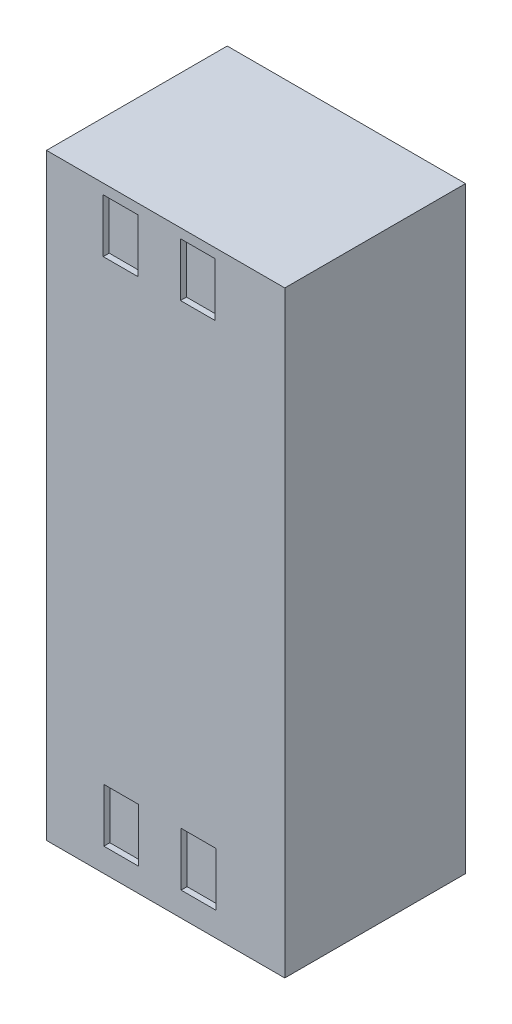
ISO-10303-21;
HEADER;
FILE_DESCRIPTION(('STEP AP214'),'2;1');
FILE_NAME('part.step','',(''),(''),'','','');
FILE_SCHEMA(('AUTOMOTIVE_DESIGN { 1 0 10303 214 1 1 1 1 }'));
ENDSEC;
DATA;
#1=APPLICATION_CONTEXT('core data for automotive mechanical design processes');
#2=APPLICATION_PROTOCOL_DEFINITION('international standard','automotive_design',2000,#1);
#3=PRODUCT_CONTEXT('',#1,'mechanical');
#4=PRODUCT('Part','Part','',(#3));
#5=PRODUCT_RELATED_PRODUCT_CATEGORY('part','',(#4));
#6=PRODUCT_DEFINITION_FORMATION('','',#4);
#7=PRODUCT_DEFINITION_CONTEXT('part definition',#1,'design');
#8=PRODUCT_DEFINITION('design','',#6,#7);
#9=PRODUCT_DEFINITION_SHAPE('','',#8);
#10=(LENGTH_UNIT() NAMED_UNIT(*) SI_UNIT(.MILLI.,.METRE.));
#11=(NAMED_UNIT(*) PLANE_ANGLE_UNIT() SI_UNIT($,.RADIAN.));
#12=(NAMED_UNIT(*) SI_UNIT($,.STERADIAN.) SOLID_ANGLE_UNIT());
#13=UNCERTAINTY_MEASURE_WITH_UNIT(LENGTH_MEASURE(1.E-05),#10,'distance_accuracy_value','');
#14=(GEOMETRIC_REPRESENTATION_CONTEXT(3) GLOBAL_UNCERTAINTY_ASSIGNED_CONTEXT((#13)) GLOBAL_UNIT_ASSIGNED_CONTEXT((#10,
#11,#12)) REPRESENTATION_CONTEXT('',''));
#15=CARTESIAN_POINT('',(0.,0.,0.));
#16=DIRECTION('',(0.,0.,1.));
#17=DIRECTION('',(1.,0.,0.));
#18=AXIS2_PLACEMENT_3D('',#15,#16,#17);
#19=CARTESIAN_POINT('',(0.,0.,38.354));
#20=DIRECTION('',(1.,0.,0.));
#21=DIRECTION('',(0.,0.,-1.));
#22=AXIS2_PLACEMENT_3D('',#19,#20,#21);
#23=PLANE('',#22);
#24=DIRECTION('',(0.,-1.,0.));
#25=VECTOR('',#24,1.);
#26=CARTESIAN_POINT('',(0.,0.,0.));
#27=LINE('',#26,#25);
#28=CARTESIAN_POINT('',(0.,0.,0.));
#29=VERTEX_POINT('',#28);
#30=CARTESIAN_POINT('',(0.,-126.812282011967,0.));
#31=VERTEX_POINT('',#30);
#32=EDGE_CURVE('E388',#29,#31,#27,.T.);
#33=ORIENTED_EDGE('',*,*,#32,.T.);
#34=DIRECTION('',(0.,0.,-1.));
#35=VECTOR('',#34,1.);
#36=CARTESIAN_POINT('',(0.,-126.812282011967,38.354));
#37=LINE('',#36,#35);
#38=CARTESIAN_POINT('',(0.,-126.812282011967,38.354));
#39=VERTEX_POINT('',#38);
#40=EDGE_CURVE('E421',#39,#31,#37,.T.);
#41=ORIENTED_EDGE('',*,*,#40,.F.);
#42=DIRECTION('',(0.,-1.,0.));
#43=VECTOR('',#42,1.);
#44=CARTESIAN_POINT('',(0.,0.,38.354));
#45=LINE('',#44,#43);
#46=CARTESIAN_POINT('',(0.,0.,38.354));
#47=VERTEX_POINT('',#46);
#48=EDGE_CURVE('E395',#47,#39,#45,.T.);
#49=ORIENTED_EDGE('',*,*,#48,.F.);
#50=DIRECTION('',(0.,0.,-1.));
#51=VECTOR('',#50,1.);
#52=CARTESIAN_POINT('',(0.,0.,38.354));
#53=LINE('',#52,#51);
#54=EDGE_CURVE('E405',#47,#29,#53,.T.);
#55=ORIENTED_EDGE('',*,*,#54,.T.);
#56=EDGE_LOOP('',(#33,#41,#49,#55));
#57=FACE_BOUND('',#56,.T.);
#58=ADVANCED_FACE('F43',(#57),#23,.F.);
#59=CARTESIAN_POINT('',(0.,-126.812282011967,38.354));
#60=DIRECTION('',(0.,1.,0.));
#61=DIRECTION('',(0.,0.,1.));
#62=AXIS2_PLACEMENT_3D('',#59,#60,#61);
#63=PLANE('',#62);
#64=DIRECTION('',(1.,0.,0.));
#65=VECTOR('',#64,1.);
#66=CARTESIAN_POINT('',(0.,-126.812282011967,0.));
#67=LINE('',#66,#65);
#68=CARTESIAN_POINT('',(50.5658640729152,-126.812282011967,0.));
#69=VERTEX_POINT('',#68);
#70=EDGE_CURVE('E408',#31,#69,#67,.T.);
#71=ORIENTED_EDGE('',*,*,#70,.T.);
#72=DIRECTION('',(0.,0.,-1.));
#73=VECTOR('',#72,1.);
#74=CARTESIAN_POINT('',(50.5658640729152,-126.812282011967,38.354));
#75=LINE('',#74,#73);
#76=CARTESIAN_POINT('',(50.5658640729152,-126.812282011967,38.354));
#77=VERTEX_POINT('',#76);
#78=EDGE_CURVE('E418',#77,#69,#75,.T.);
#79=ORIENTED_EDGE('',*,*,#78,.F.);
#80=DIRECTION('',(1.,0.,0.));
#81=VECTOR('',#80,1.);
#82=CARTESIAN_POINT('',(0.,-126.812282011967,38.354));
#83=LINE('',#82,#81);
#84=EDGE_CURVE('E398',#39,#77,#83,.T.);
#85=ORIENTED_EDGE('',*,*,#84,.F.);
#86=ORIENTED_EDGE('',*,*,#40,.T.);
#87=EDGE_LOOP('',(#71,#79,#85,#86));
#88=FACE_BOUND('',#87,.T.);
#89=ADVANCED_FACE('F486',(#88),#63,.F.);
#90=CARTESIAN_POINT('',(50.5658640729152,0.,38.354));
#91=DIRECTION('',(-1.,0.,0.));
#92=DIRECTION('',(0.,0.,1.));
#93=AXIS2_PLACEMENT_3D('',#90,#91,#92);
#94=PLANE('',#93);
#95=DIRECTION('',(0.,1.,0.));
#96=VECTOR('',#95,1.);
#97=CARTESIAN_POINT('',(50.5658640729152,0.,0.));
#98=LINE('',#97,#96);
#99=CARTESIAN_POINT('',(50.5658640729152,0.,0.));
#100=VERTEX_POINT('',#99);
#101=EDGE_CURVE('E410',#69,#100,#98,.T.);
#102=ORIENTED_EDGE('',*,*,#101,.T.);
#103=DIRECTION('',(0.,0.,-1.));
#104=VECTOR('',#103,1.);
#105=CARTESIAN_POINT('',(50.5658640729152,0.,38.354));
#106=LINE('',#105,#104);
#107=CARTESIAN_POINT('',(50.5658640729152,0.,38.354));
#108=VERTEX_POINT('',#107);
#109=EDGE_CURVE('E415',#108,#100,#106,.T.);
#110=ORIENTED_EDGE('',*,*,#109,.F.);
#111=DIRECTION('',(0.,1.,0.));
#112=VECTOR('',#111,1.);
#113=CARTESIAN_POINT('',(50.5658640729152,0.,38.354));
#114=LINE('',#113,#112);
#115=EDGE_CURVE('E401',#77,#108,#114,.T.);
#116=ORIENTED_EDGE('',*,*,#115,.F.);
#117=ORIENTED_EDGE('',*,*,#78,.T.);
#118=EDGE_LOOP('',(#102,#110,#116,#117));
#119=FACE_BOUND('',#118,.T.);
#120=ADVANCED_FACE('F490',(#119),#94,.F.);
#121=CARTESIAN_POINT('',(0.,0.,38.354));
#122=DIRECTION('',(0.,-1.,0.));
#123=DIRECTION('',(0.,0.,-1.));
#124=AXIS2_PLACEMENT_3D('',#121,#122,#123);
#125=PLANE('',#124);
#126=DIRECTION('',(-1.,0.,0.));
#127=VECTOR('',#126,1.);
#128=CARTESIAN_POINT('',(0.,0.,0.));
#129=LINE('',#128,#127);
#130=EDGE_CURVE('E399',#100,#29,#129,.T.);
#131=ORIENTED_EDGE('',*,*,#130,.T.);
#132=ORIENTED_EDGE('',*,*,#54,.F.);
#133=DIRECTION('',(-1.,0.,0.));
#134=VECTOR('',#133,1.);
#135=CARTESIAN_POINT('',(0.,0.,38.354));
#136=LINE('',#135,#134);
#137=EDGE_CURVE('E403',#108,#47,#136,.T.);
#138=ORIENTED_EDGE('',*,*,#137,.F.);
#139=ORIENTED_EDGE('',*,*,#109,.T.);
#140=EDGE_LOOP('',(#131,#132,#138,#139));
#141=FACE_BOUND('',#140,.T.);
#142=ADVANCED_FACE('F494',(#141),#125,.F.);
#143=CARTESIAN_POINT('',(0.,0.,38.354));
#144=DIRECTION('',(0.,0.,1.));
#145=DIRECTION('',(1.,0.,0.));
#146=AXIS2_PLACEMENT_3D('',#143,#144,#145);
#147=PLANE('',#146);
#148=DIRECTION('',(0.,-1.,0.));
#149=VECTOR('',#148,1.);
#150=CARTESIAN_POINT('',(28.565766674965,-110.300002704912,38.354));
#151=LINE('',#150,#149);
#152=CARTESIAN_POINT('',(28.565766674965,-110.300002704912,38.354));
#153=VERTEX_POINT('',#152);
#154=CARTESIAN_POINT('',(28.565766674965,-121.661911213981,38.354));
#155=VERTEX_POINT('',#154);
#156=EDGE_CURVE('E69',#153,#155,#151,.T.);
#157=ORIENTED_EDGE('',*,*,#156,.F.);
#158=DIRECTION('',(-1.,0.,0.));
#159=VECTOR('',#158,1.);
#160=CARTESIAN_POINT('',(28.565766674965,-110.300002704912,38.354));
#161=LINE('',#160,#159);
#162=CARTESIAN_POINT('',(35.9408687517537,-110.300002704912,38.354));
#163=VERTEX_POINT('',#162);
#164=EDGE_CURVE('E305',#163,#153,#161,.T.);
#165=ORIENTED_EDGE('',*,*,#164,.F.);
#166=DIRECTION('',(0.,1.,0.));
#167=VECTOR('',#166,1.);
#168=CARTESIAN_POINT('',(35.9408687517537,-110.300002704912,38.354));
#169=LINE('',#168,#167);
#170=CARTESIAN_POINT('',(35.9408687517537,-121.661911213981,38.354));
#171=VERTEX_POINT('',#170);
#172=EDGE_CURVE('E320',#171,#163,#169,.T.);
#173=ORIENTED_EDGE('',*,*,#172,.F.);
#174=DIRECTION('',(1.,0.,0.));
#175=VECTOR('',#174,1.);
#176=CARTESIAN_POINT('',(28.565766674965,-121.661911213981,38.354));
#177=LINE('',#176,#175);
#178=EDGE_CURVE('E316',#155,#171,#177,.T.);
#179=ORIENTED_EDGE('',*,*,#178,.F.);
#180=EDGE_LOOP('',(#157,#165,#173,#179));
#181=FACE_BOUND('',#180,.T.);
#182=DIRECTION('',(0.,-1.,0.));
#183=VECTOR('',#182,1.);
#184=CARTESIAN_POINT('',(12.0423744546179,-2.14202593229859,38.354));
#185=LINE('',#184,#183);
#186=CARTESIAN_POINT('',(12.0423744546179,-2.14202593229859,38.354));
#187=VERTEX_POINT('',#186);
#188=CARTESIAN_POINT('',(12.0423744546179,-13.5039344413683,38.354));
#189=VERTEX_POINT('',#188);
#190=EDGE_CURVE('E294',#187,#189,#185,.T.);
#191=ORIENTED_EDGE('',*,*,#190,.F.);
#192=DIRECTION('',(-1.,0.,0.));
#193=VECTOR('',#192,1.);
#194=CARTESIAN_POINT('',(12.0423744546179,-2.14202593229859,38.354));
#195=LINE('',#194,#193);
#196=CARTESIAN_POINT('',(19.4174765314066,-2.14202593229859,38.354));
#197=VERTEX_POINT('',#196);
#198=EDGE_CURVE('E337',#197,#187,#195,.T.);
#199=ORIENTED_EDGE('',*,*,#198,.F.);
#200=DIRECTION('',(0.,1.,0.));
#201=VECTOR('',#200,1.);
#202=CARTESIAN_POINT('',(19.4174765314066,-2.14202593229859,38.354));
#203=LINE('',#202,#201);
#204=CARTESIAN_POINT('',(19.4174765314066,-13.5039344413683,38.354));
#205=VERTEX_POINT('',#204);
#206=EDGE_CURVE('E351',#205,#197,#203,.T.);
#207=ORIENTED_EDGE('',*,*,#206,.F.);
#208=DIRECTION('',(1.,0.,0.));
#209=VECTOR('',#208,1.);
#210=CARTESIAN_POINT('',(12.0423744546179,-13.5039344413683,38.354));
#211=LINE('',#210,#209);
#212=EDGE_CURVE('E348',#189,#205,#211,.T.);
#213=ORIENTED_EDGE('',*,*,#212,.F.);
#214=EDGE_LOOP('',(#191,#199,#207,#213));
#215=FACE_BOUND('',#214,.T.);
#216=DIRECTION('',(0.,-1.,0.));
#217=VECTOR('',#216,1.);
#218=CARTESIAN_POINT('',(28.4364917350712,-2.02033363505419,38.354));
#219=LINE('',#218,#217);
#220=CARTESIAN_POINT('',(28.4364917350712,-2.02033363505419,38.354));
#221=VERTEX_POINT('',#220);
#222=CARTESIAN_POINT('',(28.4364917350712,-13.3822421441239,38.354));
#223=VERTEX_POINT('',#222);
#224=EDGE_CURVE('E265',#221,#223,#219,.T.);
#225=ORIENTED_EDGE('',*,*,#224,.F.);
#226=DIRECTION('',(-1.,0.,0.));
#227=VECTOR('',#226,1.);
#228=CARTESIAN_POINT('',(28.4364917350712,-2.02033363505419,38.354));
#229=LINE('',#228,#227);
#230=CARTESIAN_POINT('',(35.8115938118599,-2.02033363505419,38.354));
#231=VERTEX_POINT('',#230);
#232=EDGE_CURVE('E273',#231,#221,#229,.T.);
#233=ORIENTED_EDGE('',*,*,#232,.F.);
#234=DIRECTION('',(0.,1.,0.));
#235=VECTOR('',#234,1.);
#236=CARTESIAN_POINT('',(35.8115938118599,-2.02033363505419,38.354));
#237=LINE('',#236,#235);
#238=CARTESIAN_POINT('',(35.8115938118599,-13.3822421441239,38.354));
#239=VERTEX_POINT('',#238);
#240=EDGE_CURVE('E287',#239,#231,#237,.T.);
#241=ORIENTED_EDGE('',*,*,#240,.F.);
#242=DIRECTION('',(1.,0.,0.));
#243=VECTOR('',#242,1.);
#244=CARTESIAN_POINT('',(28.4364917350712,-13.3822421441239,38.354));
#245=LINE('',#244,#243);
#246=EDGE_CURVE('E284',#223,#239,#245,.T.);
#247=ORIENTED_EDGE('',*,*,#246,.F.);
#248=EDGE_LOOP('',(#225,#233,#241,#247));
#249=FACE_BOUND('',#248,.T.);
#250=DIRECTION('',(0.,-1.,0.));
#251=VECTOR('',#250,1.);
#252=CARTESIAN_POINT('',(12.1716493945116,-110.421695002156,38.354));
#253=LINE('',#252,#251);
#254=CARTESIAN_POINT('',(12.1716493945116,-110.421695002156,38.354));
#255=VERTEX_POINT('',#254);
#256=CARTESIAN_POINT('',(12.1716493945116,-121.783603511226,38.354));
#257=VERTEX_POINT('',#256);
#258=EDGE_CURVE('E327',#255,#257,#253,.T.);
#259=ORIENTED_EDGE('',*,*,#258,.F.);
#260=DIRECTION('',(-1.,0.,0.));
#261=VECTOR('',#260,1.);
#262=CARTESIAN_POINT('',(12.1716493945116,-110.421695002156,38.354));
#263=LINE('',#262,#261);
#264=CARTESIAN_POINT('',(19.5467514713004,-110.421695002156,38.354));
#265=VERTEX_POINT('',#264);
#266=EDGE_CURVE('E367',#265,#255,#263,.T.);
#267=ORIENTED_EDGE('',*,*,#266,.F.);
#268=DIRECTION('',(0.,1.,0.));
#269=VECTOR('',#268,1.);
#270=CARTESIAN_POINT('',(19.5467514713004,-110.421695002156,38.354));
#271=LINE('',#270,#269);
#272=CARTESIAN_POINT('',(19.5467514713004,-121.783603511226,38.354));
#273=VERTEX_POINT('',#272);
#274=EDGE_CURVE('E381',#273,#265,#271,.T.);
#275=ORIENTED_EDGE('',*,*,#274,.F.);
#276=DIRECTION('',(1.,0.,0.));
#277=VECTOR('',#276,1.);
#278=CARTESIAN_POINT('',(12.1716493945116,-121.783603511226,38.354));
#279=LINE('',#278,#277);
#280=EDGE_CURVE('E378',#257,#273,#279,.T.);
#281=ORIENTED_EDGE('',*,*,#280,.F.);
#282=EDGE_LOOP('',(#259,#267,#275,#281));
#283=FACE_BOUND('',#282,.T.);
#284=ORIENTED_EDGE('',*,*,#48,.T.);
#285=ORIENTED_EDGE('',*,*,#84,.T.);
#286=ORIENTED_EDGE('',*,*,#115,.T.);
#287=ORIENTED_EDGE('',*,*,#137,.T.);
#288=EDGE_LOOP('',(#284,#285,#286,#287));
#289=FACE_BOUND('',#288,.T.);
#290=ADVANCED_FACE('F498',(#181,#215,#249,#283,#289),#147,.T.);
#291=CARTESIAN_POINT('',(0.,0.,0.));
#292=DIRECTION('',(0.,0.,1.));
#293=DIRECTION('',(1.,0.,0.));
#294=AXIS2_PLACEMENT_3D('',#291,#292,#293);
#295=PLANE('',#294);
#296=DIRECTION('',(0.,-1.,0.));
#297=VECTOR('',#296,1.);
#298=CARTESIAN_POINT('',(7.59969222769016,-99.8985122377537,0.));
#299=LINE('',#298,#297);
#300=CARTESIAN_POINT('',(7.59969222769016,-99.8985122377537,0.));
#301=VERTEX_POINT('',#300);
#302=CARTESIAN_POINT('',(7.59969222769016,-118.92720145347,0.));
#303=VERTEX_POINT('',#302);
#304=EDGE_CURVE('E259',#301,#303,#299,.T.);
#305=ORIENTED_EDGE('',*,*,#304,.T.);
#306=DIRECTION('',(-1.,0.,0.));
#307=VECTOR('',#306,1.);
#308=CARTESIAN_POINT('',(43.3079876175795,-118.92720145347,0.));
#309=LINE('',#308,#307);
#310=CARTESIAN_POINT('',(43.3079876175795,-118.92720145347,0.));
#311=VERTEX_POINT('',#310);
#312=EDGE_CURVE('E61',#311,#303,#309,.T.);
#313=ORIENTED_EDGE('',*,*,#312,.F.);
#314=DIRECTION('',(0.,-1.,0.));
#315=VECTOR('',#314,1.);
#316=CARTESIAN_POINT('',(43.3079876175795,-99.8985122377537,0.));
#317=LINE('',#316,#315);
#318=CARTESIAN_POINT('',(43.3079876175795,-99.8985122377537,0.));
#319=VERTEX_POINT('',#318);
#320=EDGE_CURVE('E250',#319,#311,#317,.T.);
#321=ORIENTED_EDGE('',*,*,#320,.F.);
#322=DIRECTION('',(-1.,0.,0.));
#323=VECTOR('',#322,1.);
#324=CARTESIAN_POINT('',(43.3079876175795,-99.8985122377537,0.));
#325=LINE('',#324,#323);
#326=EDGE_CURVE('E253',#319,#301,#325,.T.);
#327=ORIENTED_EDGE('',*,*,#326,.T.);
#328=EDGE_LOOP('',(#305,#313,#321,#327));
#329=FACE_BOUND('',#328,.T.);
#330=ORIENTED_EDGE('',*,*,#32,.F.);
#331=ORIENTED_EDGE('',*,*,#130,.F.);
#332=ORIENTED_EDGE('',*,*,#101,.F.);
#333=ORIENTED_EDGE('',*,*,#70,.F.);
#334=EDGE_LOOP('',(#330,#331,#332,#333));
#335=FACE_BOUND('',#334,.T.);
#336=ADVANCED_FACE('F500',(#329,#335),#295,.F.);
#337=CARTESIAN_POINT('',(12.1716493945116,-110.421695002156,37.084));
#338=DIRECTION('',(-1.,0.,0.));
#339=DIRECTION('',(0.,-1.,0.));
#340=AXIS2_PLACEMENT_3D('',#337,#338,#339);
#341=PLANE('',#340);
#342=ORIENTED_EDGE('',*,*,#258,.T.);
#343=DIRECTION('',(0.,0.,1.));
#344=VECTOR('',#343,1.);
#345=CARTESIAN_POINT('',(12.1716493945116,-121.783603511226,37.084));
#346=LINE('',#345,#344);
#347=CARTESIAN_POINT('',(12.1716493945116,-121.783603511226,37.084));
#348=VERTEX_POINT('',#347);
#349=EDGE_CURVE('E376',#348,#257,#346,.T.);
#350=ORIENTED_EDGE('',*,*,#349,.F.);
#351=DIRECTION('',(0.,-1.,0.));
#352=VECTOR('',#351,1.);
#353=CARTESIAN_POINT('',(12.1716493945116,-110.421695002156,37.084));
#354=LINE('',#353,#352);
#355=CARTESIAN_POINT('',(12.1716493945116,-110.421695002156,37.084));
#356=VERTEX_POINT('',#355);
#357=EDGE_CURVE('E363',#356,#348,#354,.T.);
#358=ORIENTED_EDGE('',*,*,#357,.F.);
#359=DIRECTION('',(0.,0.,1.));
#360=VECTOR('',#359,1.);
#361=CARTESIAN_POINT('',(12.1716493945116,-110.421695002156,37.084));
#362=LINE('',#361,#360);
#363=EDGE_CURVE('E386',#356,#255,#362,.T.);
#364=ORIENTED_EDGE('',*,*,#363,.T.);
#365=EDGE_LOOP('',(#342,#350,#358,#364));
#366=FACE_BOUND('',#365,.T.);
#367=ADVANCED_FACE('F503',(#366),#341,.F.);
#368=CARTESIAN_POINT('',(12.1716493945116,-110.421695002156,37.084));
#369=DIRECTION('',(0.,1.,0.));
#370=DIRECTION('',(0.,0.,1.));
#371=AXIS2_PLACEMENT_3D('',#368,#369,#370);
#372=PLANE('',#371);
#373=ORIENTED_EDGE('',*,*,#266,.T.);
#374=ORIENTED_EDGE('',*,*,#363,.F.);
#375=DIRECTION('',(-1.,0.,0.));
#376=VECTOR('',#375,1.);
#377=CARTESIAN_POINT('',(12.1716493945116,-110.421695002156,37.084));
#378=LINE('',#377,#376);
#379=CARTESIAN_POINT('',(19.5467514713004,-110.421695002156,37.084));
#380=VERTEX_POINT('',#379);
#381=EDGE_CURVE('E373',#380,#356,#378,.T.);
#382=ORIENTED_EDGE('',*,*,#381,.F.);
#383=DIRECTION('',(0.,0.,1.));
#384=VECTOR('',#383,1.);
#385=CARTESIAN_POINT('',(19.5467514713004,-110.421695002156,37.084));
#386=LINE('',#385,#384);
#387=EDGE_CURVE('E389',#380,#265,#386,.T.);
#388=ORIENTED_EDGE('',*,*,#387,.T.);
#389=EDGE_LOOP('',(#373,#374,#382,#388));
#390=FACE_BOUND('',#389,.T.);
#391=ADVANCED_FACE('F510',(#390),#372,.F.);
#392=CARTESIAN_POINT('',(19.5467514713004,-110.421695002156,37.084));
#393=DIRECTION('',(1.,0.,0.));
#394=DIRECTION('',(0.,0.,-1.));
#395=AXIS2_PLACEMENT_3D('',#392,#393,#394);
#396=PLANE('',#395);
#397=ORIENTED_EDGE('',*,*,#274,.T.);
#398=ORIENTED_EDGE('',*,*,#387,.F.);
#399=DIRECTION('',(0.,1.,0.));
#400=VECTOR('',#399,1.);
#401=CARTESIAN_POINT('',(19.5467514713004,-110.421695002156,37.084));
#402=LINE('',#401,#400);
#403=CARTESIAN_POINT('',(19.5467514713004,-121.783603511226,37.084));
#404=VERTEX_POINT('',#403);
#405=EDGE_CURVE('E370',#404,#380,#402,.T.);
#406=ORIENTED_EDGE('',*,*,#405,.F.);
#407=DIRECTION('',(0.,0.,1.));
#408=VECTOR('',#407,1.);
#409=CARTESIAN_POINT('',(19.5467514713004,-121.783603511226,37.084));
#410=LINE('',#409,#408);
#411=EDGE_CURVE('E391',#404,#273,#410,.T.);
#412=ORIENTED_EDGE('',*,*,#411,.T.);
#413=EDGE_LOOP('',(#397,#398,#406,#412));
#414=FACE_BOUND('',#413,.T.);
#415=ADVANCED_FACE('F516',(#414),#396,.F.);
#416=CARTESIAN_POINT('',(12.1716493945116,-121.783603511226,37.084));
#417=DIRECTION('',(0.,-1.,0.));
#418=DIRECTION('',(0.,0.,-1.));
#419=AXIS2_PLACEMENT_3D('',#416,#417,#418);
#420=PLANE('',#419);
#421=ORIENTED_EDGE('',*,*,#280,.T.);
#422=ORIENTED_EDGE('',*,*,#411,.F.);
#423=DIRECTION('',(1.,0.,0.));
#424=VECTOR('',#423,1.);
#425=CARTESIAN_POINT('',(12.1716493945116,-121.783603511226,37.084));
#426=LINE('',#425,#424);
#427=EDGE_CURVE('E366',#348,#404,#426,.T.);
#428=ORIENTED_EDGE('',*,*,#427,.F.);
#429=ORIENTED_EDGE('',*,*,#349,.T.);
#430=EDGE_LOOP('',(#421,#422,#428,#429));
#431=FACE_BOUND('',#430,.T.);
#432=ADVANCED_FACE('F512',(#431),#420,.F.);
#433=CARTESIAN_POINT('',(0.,0.,37.084));
#434=DIRECTION('',(0.,0.,1.));
#435=DIRECTION('',(1.,0.,0.));
#436=AXIS2_PLACEMENT_3D('',#433,#434,#435);
#437=PLANE('',#436);
#438=ORIENTED_EDGE('',*,*,#357,.T.);
#439=ORIENTED_EDGE('',*,*,#427,.T.);
#440=ORIENTED_EDGE('',*,*,#405,.T.);
#441=ORIENTED_EDGE('',*,*,#381,.T.);
#442=EDGE_LOOP('',(#438,#439,#440,#441));
#443=FACE_BOUND('',#442,.T.);
#444=ADVANCED_FACE('F515',(#443),#437,.T.);
#445=CARTESIAN_POINT('',(28.4364917350712,-2.02033363505419,37.084));
#446=DIRECTION('',(-1.,0.,0.));
#447=DIRECTION('',(0.,0.,1.));
#448=AXIS2_PLACEMENT_3D('',#445,#446,#447);
#449=PLANE('',#448);
#450=ORIENTED_EDGE('',*,*,#224,.T.);
#451=DIRECTION('',(0.,0.,1.));
#452=VECTOR('',#451,1.);
#453=CARTESIAN_POINT('',(28.4364917350712,-13.3822421441239,37.084));
#454=LINE('',#453,#452);
#455=CARTESIAN_POINT('',(28.4364917350712,-13.3822421441239,37.084));
#456=VERTEX_POINT('',#455);
#457=EDGE_CURVE('E282',#456,#223,#454,.T.);
#458=ORIENTED_EDGE('',*,*,#457,.F.);
#459=DIRECTION('',(0.,-1.,0.));
#460=VECTOR('',#459,1.);
#461=CARTESIAN_POINT('',(28.4364917350712,-2.02033363505419,37.084));
#462=LINE('',#461,#460);
#463=CARTESIAN_POINT('',(28.4364917350712,-2.02033363505419,37.084));
#464=VERTEX_POINT('',#463);
#465=EDGE_CURVE('E269',#464,#456,#462,.T.);
#466=ORIENTED_EDGE('',*,*,#465,.F.);
#467=DIRECTION('',(0.,0.,1.));
#468=VECTOR('',#467,1.);
#469=CARTESIAN_POINT('',(28.4364917350712,-2.02033363505419,37.084));
#470=LINE('',#469,#468);
#471=EDGE_CURVE('E292',#464,#221,#470,.T.);
#472=ORIENTED_EDGE('',*,*,#471,.T.);
#473=EDGE_LOOP('',(#450,#458,#466,#472));
#474=FACE_BOUND('',#473,.T.);
#475=ADVANCED_FACE('F526',(#474),#449,.F.);
#476=CARTESIAN_POINT('',(28.4364917350712,-2.02033363505419,37.084));
#477=DIRECTION('',(0.,1.,0.));
#478=DIRECTION('',(0.,0.,1.));
#479=AXIS2_PLACEMENT_3D('',#476,#477,#478);
#480=PLANE('',#479);
#481=ORIENTED_EDGE('',*,*,#232,.T.);
#482=ORIENTED_EDGE('',*,*,#471,.F.);
#483=DIRECTION('',(-1.,0.,0.));
#484=VECTOR('',#483,1.);
#485=CARTESIAN_POINT('',(28.4364917350712,-2.02033363505419,37.084));
#486=LINE('',#485,#484);
#487=CARTESIAN_POINT('',(35.8115938118599,-2.02033363505419,37.084));
#488=VERTEX_POINT('',#487);
#489=EDGE_CURVE('E279',#488,#464,#486,.T.);
#490=ORIENTED_EDGE('',*,*,#489,.F.);
#491=DIRECTION('',(0.,0.,1.));
#492=VECTOR('',#491,1.);
#493=CARTESIAN_POINT('',(35.8115938118599,-2.02033363505419,37.084));
#494=LINE('',#493,#492);
#495=EDGE_CURVE('E295',#488,#231,#494,.T.);
#496=ORIENTED_EDGE('',*,*,#495,.T.);
#497=EDGE_LOOP('',(#481,#482,#490,#496));
#498=FACE_BOUND('',#497,.T.);
#499=ADVANCED_FACE('F569',(#498),#480,.F.);
#500=CARTESIAN_POINT('',(35.8115938118599,-2.02033363505419,37.084));
#501=DIRECTION('',(1.,0.,0.));
#502=DIRECTION('',(0.,0.,-1.));
#503=AXIS2_PLACEMENT_3D('',#500,#501,#502);
#504=PLANE('',#503);
#505=ORIENTED_EDGE('',*,*,#240,.T.);
#506=ORIENTED_EDGE('',*,*,#495,.F.);
#507=DIRECTION('',(0.,1.,0.));
#508=VECTOR('',#507,1.);
#509=CARTESIAN_POINT('',(35.8115938118599,-2.02033363505419,37.084));
#510=LINE('',#509,#508);
#511=CARTESIAN_POINT('',(35.8115938118599,-13.3822421441239,37.084));
#512=VERTEX_POINT('',#511);
#513=EDGE_CURVE('E276',#512,#488,#510,.T.);
#514=ORIENTED_EDGE('',*,*,#513,.F.);
#515=DIRECTION('',(0.,0.,1.));
#516=VECTOR('',#515,1.);
#517=CARTESIAN_POINT('',(35.8115938118599,-13.3822421441239,37.084));
#518=LINE('',#517,#516);
#519=EDGE_CURVE('E297',#512,#239,#518,.T.);
#520=ORIENTED_EDGE('',*,*,#519,.T.);
#521=EDGE_LOOP('',(#505,#506,#514,#520));
#522=FACE_BOUND('',#521,.T.);
#523=ADVANCED_FACE('F574',(#522),#504,.F.);
#524=CARTESIAN_POINT('',(28.4364917350712,-13.3822421441239,37.084));
#525=DIRECTION('',(0.,-1.,0.));
#526=DIRECTION('',(0.,0.,-1.));
#527=AXIS2_PLACEMENT_3D('',#524,#525,#526);
#528=PLANE('',#527);
#529=ORIENTED_EDGE('',*,*,#246,.T.);
#530=ORIENTED_EDGE('',*,*,#519,.F.);
#531=DIRECTION('',(1.,0.,0.));
#532=VECTOR('',#531,1.);
#533=CARTESIAN_POINT('',(28.4364917350712,-13.3822421441239,37.084));
#534=LINE('',#533,#532);
#535=EDGE_CURVE('E272',#456,#512,#534,.T.);
#536=ORIENTED_EDGE('',*,*,#535,.F.);
#537=ORIENTED_EDGE('',*,*,#457,.T.);
#538=EDGE_LOOP('',(#529,#530,#536,#537));
#539=FACE_BOUND('',#538,.T.);
#540=ADVANCED_FACE('F571',(#539),#528,.F.);
#541=CARTESIAN_POINT('',(0.,0.,37.084));
#542=DIRECTION('',(0.,0.,1.));
#543=DIRECTION('',(1.,0.,0.));
#544=AXIS2_PLACEMENT_3D('',#541,#542,#543);
#545=PLANE('',#544);
#546=ORIENTED_EDGE('',*,*,#465,.T.);
#547=ORIENTED_EDGE('',*,*,#535,.T.);
#548=ORIENTED_EDGE('',*,*,#513,.T.);
#549=ORIENTED_EDGE('',*,*,#489,.T.);
#550=EDGE_LOOP('',(#546,#547,#548,#549));
#551=FACE_BOUND('',#550,.T.);
#552=ADVANCED_FACE('F532',(#551),#545,.T.);
#553=CARTESIAN_POINT('',(12.0423744546179,-2.14202593229859,37.084));
#554=DIRECTION('',(-1.,0.,0.));
#555=DIRECTION('',(0.,-1.,0.));
#556=AXIS2_PLACEMENT_3D('',#553,#554,#555);
#557=PLANE('',#556);
#558=ORIENTED_EDGE('',*,*,#190,.T.);
#559=DIRECTION('',(0.,0.,1.));
#560=VECTOR('',#559,1.);
#561=CARTESIAN_POINT('',(12.0423744546179,-13.5039344413683,37.084));
#562=LINE('',#561,#560);
#563=CARTESIAN_POINT('',(12.0423744546179,-13.5039344413683,37.084));
#564=VERTEX_POINT('',#563);
#565=EDGE_CURVE('E346',#564,#189,#562,.T.);
#566=ORIENTED_EDGE('',*,*,#565,.F.);
#567=DIRECTION('',(0.,-1.,0.));
#568=VECTOR('',#567,1.);
#569=CARTESIAN_POINT('',(12.0423744546179,-2.14202593229859,37.084));
#570=LINE('',#569,#568);
#571=CARTESIAN_POINT('',(12.0423744546179,-2.14202593229859,37.084));
#572=VERTEX_POINT('',#571);
#573=EDGE_CURVE('E333',#572,#564,#570,.T.);
#574=ORIENTED_EDGE('',*,*,#573,.F.);
#575=DIRECTION('',(0.,0.,1.));
#576=VECTOR('',#575,1.);
#577=CARTESIAN_POINT('',(12.0423744546179,-2.14202593229859,37.084));
#578=LINE('',#577,#576);
#579=EDGE_CURVE('E317',#572,#187,#578,.T.);
#580=ORIENTED_EDGE('',*,*,#579,.T.);
#581=EDGE_LOOP('',(#558,#566,#574,#580));
#582=FACE_BOUND('',#581,.T.);
#583=ADVANCED_FACE('F528',(#582),#557,.F.);
#584=CARTESIAN_POINT('',(12.0423744546179,-2.14202593229859,37.084));
#585=DIRECTION('',(0.,1.,0.));
#586=DIRECTION('',(0.,0.,1.));
#587=AXIS2_PLACEMENT_3D('',#584,#585,#586);
#588=PLANE('',#587);
#589=ORIENTED_EDGE('',*,*,#198,.T.);
#590=ORIENTED_EDGE('',*,*,#579,.F.);
#591=DIRECTION('',(-1.,0.,0.));
#592=VECTOR('',#591,1.);
#593=CARTESIAN_POINT('',(12.0423744546179,-2.14202593229859,37.084));
#594=LINE('',#593,#592);
#595=CARTESIAN_POINT('',(19.4174765314066,-2.14202593229859,37.084));
#596=VERTEX_POINT('',#595);
#597=EDGE_CURVE('E343',#596,#572,#594,.T.);
#598=ORIENTED_EDGE('',*,*,#597,.F.);
#599=DIRECTION('',(0.,0.,1.));
#600=VECTOR('',#599,1.);
#601=CARTESIAN_POINT('',(19.4174765314066,-2.14202593229859,37.084));
#602=LINE('',#601,#600);
#603=EDGE_CURVE('E357',#596,#197,#602,.T.);
#604=ORIENTED_EDGE('',*,*,#603,.T.);
#605=EDGE_LOOP('',(#589,#590,#598,#604));
#606=FACE_BOUND('',#605,.T.);
#607=ADVANCED_FACE('F531',(#606),#588,.F.);
#608=CARTESIAN_POINT('',(19.4174765314066,-2.14202593229859,37.084));
#609=DIRECTION('',(1.,0.,0.));
#610=DIRECTION('',(0.,1.,0.));
#611=AXIS2_PLACEMENT_3D('',#608,#609,#610);
#612=PLANE('',#611);
#613=ORIENTED_EDGE('',*,*,#206,.T.);
#614=ORIENTED_EDGE('',*,*,#603,.F.);
#615=DIRECTION('',(0.,1.,0.));
#616=VECTOR('',#615,1.);
#617=CARTESIAN_POINT('',(19.4174765314066,-2.14202593229859,37.084));
#618=LINE('',#617,#616);
#619=CARTESIAN_POINT('',(19.4174765314066,-13.5039344413683,37.084));
#620=VERTEX_POINT('',#619);
#621=EDGE_CURVE('E340',#620,#596,#618,.T.);
#622=ORIENTED_EDGE('',*,*,#621,.F.);
#623=DIRECTION('',(0.,0.,1.));
#624=VECTOR('',#623,1.);
#625=CARTESIAN_POINT('',(19.4174765314066,-13.5039344413683,37.084));
#626=LINE('',#625,#624);
#627=EDGE_CURVE('E359',#620,#205,#626,.T.);
#628=ORIENTED_EDGE('',*,*,#627,.T.);
#629=EDGE_LOOP('',(#613,#614,#622,#628));
#630=FACE_BOUND('',#629,.T.);
#631=ADVANCED_FACE('F538',(#630),#612,.F.);
#632=CARTESIAN_POINT('',(12.0423744546179,-13.5039344413683,37.084));
#633=DIRECTION('',(0.,-1.,0.));
#634=DIRECTION('',(0.,0.,-1.));
#635=AXIS2_PLACEMENT_3D('',#632,#633,#634);
#636=PLANE('',#635);
#637=ORIENTED_EDGE('',*,*,#212,.T.);
#638=ORIENTED_EDGE('',*,*,#627,.F.);
#639=DIRECTION('',(1.,0.,0.));
#640=VECTOR('',#639,1.);
#641=CARTESIAN_POINT('',(12.0423744546179,-13.5039344413683,37.084));
#642=LINE('',#641,#640);
#643=EDGE_CURVE('E336',#564,#620,#642,.T.);
#644=ORIENTED_EDGE('',*,*,#643,.F.);
#645=ORIENTED_EDGE('',*,*,#565,.T.);
#646=EDGE_LOOP('',(#637,#638,#644,#645));
#647=FACE_BOUND('',#646,.T.);
#648=ADVANCED_FACE('F534',(#647),#636,.F.);
#649=CARTESIAN_POINT('',(0.,0.,37.084));
#650=DIRECTION('',(0.,0.,1.));
#651=DIRECTION('',(1.,0.,0.));
#652=AXIS2_PLACEMENT_3D('',#649,#650,#651);
#653=PLANE('',#652);
#654=ORIENTED_EDGE('',*,*,#573,.T.);
#655=ORIENTED_EDGE('',*,*,#643,.T.);
#656=ORIENTED_EDGE('',*,*,#621,.T.);
#657=ORIENTED_EDGE('',*,*,#597,.T.);
#658=EDGE_LOOP('',(#654,#655,#656,#657));
#659=FACE_BOUND('',#658,.T.);
#660=ADVANCED_FACE('F537',(#659),#653,.T.);
#661=CARTESIAN_POINT('',(28.565766674965,-110.300002704912,37.084));
#662=DIRECTION('',(-1.,0.,0.));
#663=DIRECTION('',(0.,0.,1.));
#664=AXIS2_PLACEMENT_3D('',#661,#662,#663);
#665=PLANE('',#664);
#666=ORIENTED_EDGE('',*,*,#156,.T.);
#667=DIRECTION('',(0.,0.,1.));
#668=VECTOR('',#667,1.);
#669=CARTESIAN_POINT('',(28.565766674965,-121.661911213981,37.084));
#670=LINE('',#669,#668);
#671=CARTESIAN_POINT('',(28.565766674965,-121.661911213981,37.084));
#672=VERTEX_POINT('',#671);
#673=EDGE_CURVE('E314',#672,#155,#670,.T.);
#674=ORIENTED_EDGE('',*,*,#673,.F.);
#675=DIRECTION('',(0.,-1.,0.));
#676=VECTOR('',#675,1.);
#677=CARTESIAN_POINT('',(28.565766674965,-110.300002704912,37.084));
#678=LINE('',#677,#676);
#679=CARTESIAN_POINT('',(28.565766674965,-110.300002704912,37.084));
#680=VERTEX_POINT('',#679);
#681=EDGE_CURVE('E301',#680,#672,#678,.T.);
#682=ORIENTED_EDGE('',*,*,#681,.F.);
#683=DIRECTION('',(0.,0.,1.));
#684=VECTOR('',#683,1.);
#685=CARTESIAN_POINT('',(28.565766674965,-110.300002704912,37.084));
#686=LINE('',#685,#684);
#687=EDGE_CURVE('E325',#680,#153,#686,.T.);
#688=ORIENTED_EDGE('',*,*,#687,.T.);
#689=EDGE_LOOP('',(#666,#674,#682,#688));
#690=FACE_BOUND('',#689,.T.);
#691=ADVANCED_FACE('F548',(#690),#665,.F.);
#692=CARTESIAN_POINT('',(28.565766674965,-110.300002704912,37.084));
#693=DIRECTION('',(0.,1.,0.));
#694=DIRECTION('',(0.,0.,1.));
#695=AXIS2_PLACEMENT_3D('',#692,#693,#694);
#696=PLANE('',#695);
#697=ORIENTED_EDGE('',*,*,#164,.T.);
#698=ORIENTED_EDGE('',*,*,#687,.F.);
#699=DIRECTION('',(-1.,0.,0.));
#700=VECTOR('',#699,1.);
#701=CARTESIAN_POINT('',(28.565766674965,-110.300002704912,37.084));
#702=LINE('',#701,#700);
#703=CARTESIAN_POINT('',(35.9408687517537,-110.300002704912,37.084));
#704=VERTEX_POINT('',#703);
#705=EDGE_CURVE('E311',#704,#680,#702,.T.);
#706=ORIENTED_EDGE('',*,*,#705,.F.);
#707=DIRECTION('',(0.,0.,1.));
#708=VECTOR('',#707,1.);
#709=CARTESIAN_POINT('',(35.9408687517537,-110.300002704912,37.084));
#710=LINE('',#709,#708);
#711=EDGE_CURVE('E328',#704,#163,#710,.T.);
#712=ORIENTED_EDGE('',*,*,#711,.T.);
#713=EDGE_LOOP('',(#697,#698,#706,#712));
#714=FACE_BOUND('',#713,.T.);
#715=ADVANCED_FACE('F552',(#714),#696,.F.);
#716=CARTESIAN_POINT('',(35.9408687517537,-110.300002704912,37.084));
#717=DIRECTION('',(1.,0.,0.));
#718=DIRECTION('',(0.,0.,-1.));
#719=AXIS2_PLACEMENT_3D('',#716,#717,#718);
#720=PLANE('',#719);
#721=ORIENTED_EDGE('',*,*,#172,.T.);
#722=ORIENTED_EDGE('',*,*,#711,.F.);
#723=DIRECTION('',(0.,1.,0.));
#724=VECTOR('',#723,1.);
#725=CARTESIAN_POINT('',(35.9408687517537,-110.300002704912,37.084));
#726=LINE('',#725,#724);
#727=CARTESIAN_POINT('',(35.9408687517537,-121.661911213981,37.084));
#728=VERTEX_POINT('',#727);
#729=EDGE_CURVE('E308',#728,#704,#726,.T.);
#730=ORIENTED_EDGE('',*,*,#729,.F.);
#731=DIRECTION('',(0.,0.,1.));
#732=VECTOR('',#731,1.);
#733=CARTESIAN_POINT('',(35.9408687517537,-121.661911213981,37.084));
#734=LINE('',#733,#732);
#735=EDGE_CURVE('E330',#728,#171,#734,.T.);
#736=ORIENTED_EDGE('',*,*,#735,.T.);
#737=EDGE_LOOP('',(#721,#722,#730,#736));
#738=FACE_BOUND('',#737,.T.);
#739=ADVANCED_FACE('F557',(#738),#720,.F.);
#740=CARTESIAN_POINT('',(28.565766674965,-121.661911213981,37.084));
#741=DIRECTION('',(0.,-1.,0.));
#742=DIRECTION('',(0.,0.,-1.));
#743=AXIS2_PLACEMENT_3D('',#740,#741,#742);
#744=PLANE('',#743);
#745=ORIENTED_EDGE('',*,*,#178,.T.);
#746=ORIENTED_EDGE('',*,*,#735,.F.);
#747=DIRECTION('',(1.,0.,0.));
#748=VECTOR('',#747,1.);
#749=CARTESIAN_POINT('',(28.565766674965,-121.661911213981,37.084));
#750=LINE('',#749,#748);
#751=EDGE_CURVE('E304',#672,#728,#750,.T.);
#752=ORIENTED_EDGE('',*,*,#751,.F.);
#753=ORIENTED_EDGE('',*,*,#673,.T.);
#754=EDGE_LOOP('',(#745,#746,#752,#753));
#755=FACE_BOUND('',#754,.T.);
#756=ADVANCED_FACE('F553',(#755),#744,.F.);
#757=CARTESIAN_POINT('',(0.,0.,37.084));
#758=DIRECTION('',(0.,0.,1.));
#759=DIRECTION('',(1.,0.,0.));
#760=AXIS2_PLACEMENT_3D('',#757,#758,#759);
#761=PLANE('',#760);
#762=ORIENTED_EDGE('',*,*,#681,.T.);
#763=ORIENTED_EDGE('',*,*,#751,.T.);
#764=ORIENTED_EDGE('',*,*,#729,.T.);
#765=ORIENTED_EDGE('',*,*,#705,.T.);
#766=EDGE_LOOP('',(#762,#763,#764,#765));
#767=FACE_BOUND('',#766,.T.);
#768=ADVANCED_FACE('F556',(#767),#761,.T.);
#769=CARTESIAN_POINT('',(43.3079876175795,-118.92720145347,1.26999999999998));
#770=DIRECTION('',(0.,-1.,0.));
#771=DIRECTION('',(0.,0.,-1.));
#772=AXIS2_PLACEMENT_3D('',#769,#770,#771);
#773=PLANE('',#772);
#774=ORIENTED_EDGE('',*,*,#312,.T.);
#775=DIRECTION('',(0.,0.,-1.));
#776=VECTOR('',#775,1.);
#777=CARTESIAN_POINT('',(7.59969222769016,-118.92720145347,1.26999999999998));
#778=LINE('',#777,#776);
#779=CARTESIAN_POINT('',(7.59969222769016,-118.92720145347,1.26999999999998));
#780=VERTEX_POINT('',#779);
#781=EDGE_CURVE('E234',#780,#303,#778,.T.);
#782=ORIENTED_EDGE('',*,*,#781,.F.);
#783=DIRECTION('',(-1.,0.,0.));
#784=VECTOR('',#783,1.);
#785=CARTESIAN_POINT('',(43.3079876175795,-118.92720145347,1.26999999999998));
#786=LINE('',#785,#784);
#787=CARTESIAN_POINT('',(43.3079876175795,-118.92720145347,1.26999999999998));
#788=VERTEX_POINT('',#787);
#789=EDGE_CURVE('E241',#788,#780,#786,.T.);
#790=ORIENTED_EDGE('',*,*,#789,.F.);
#791=DIRECTION('',(0.,0.,-1.));
#792=VECTOR('',#791,1.);
#793=CARTESIAN_POINT('',(43.3079876175795,-118.92720145347,1.26999999999998));
#794=LINE('',#793,#792);
#795=EDGE_CURVE('E263',#788,#311,#794,.T.);
#796=ORIENTED_EDGE('',*,*,#795,.T.);
#797=EDGE_LOOP('',(#774,#782,#790,#796));
#798=FACE_BOUND('',#797,.T.);
#799=ADVANCED_FACE('F244',(#798),#773,.F.);
#800=CARTESIAN_POINT('',(43.3079876175795,-99.8985122377537,1.26999999999998));
#801=DIRECTION('',(1.,0.,0.));
#802=DIRECTION('',(0.,0.,-1.));
#803=AXIS2_PLACEMENT_3D('',#800,#801,#802);
#804=PLANE('',#803);
#805=ORIENTED_EDGE('',*,*,#320,.T.);
#806=ORIENTED_EDGE('',*,*,#795,.F.);
#807=DIRECTION('',(0.,-1.,0.));
#808=VECTOR('',#807,1.);
#809=CARTESIAN_POINT('',(43.3079876175795,-99.8985122377537,1.26999999999998));
#810=LINE('',#809,#808);
#811=CARTESIAN_POINT('',(43.3079876175795,-99.8985122377537,1.26999999999998));
#812=VERTEX_POINT('',#811);
#813=EDGE_CURVE('E246',#812,#788,#810,.T.);
#814=ORIENTED_EDGE('',*,*,#813,.F.);
#815=DIRECTION('',(0.,0.,-1.));
#816=VECTOR('',#815,1.);
#817=CARTESIAN_POINT('',(43.3079876175795,-99.8985122377537,1.26999999999998));
#818=LINE('',#817,#816);
#819=EDGE_CURVE('E266',#812,#319,#818,.T.);
#820=ORIENTED_EDGE('',*,*,#819,.T.);
#821=EDGE_LOOP('',(#805,#806,#814,#820));
#822=FACE_BOUND('',#821,.T.);
#823=ADVANCED_FACE('F587',(#822),#804,.F.);
#824=CARTESIAN_POINT('',(43.3079876175795,-99.8985122377537,1.26999999999998));
#825=DIRECTION('',(0.,-1.,0.));
#826=DIRECTION('',(0.,0.,-1.));
#827=AXIS2_PLACEMENT_3D('',#824,#825,#826);
#828=PLANE('',#827);
#829=ORIENTED_EDGE('',*,*,#326,.F.);
#830=ORIENTED_EDGE('',*,*,#819,.F.);
#831=DIRECTION('',(-1.,0.,0.));
#832=VECTOR('',#831,1.);
#833=CARTESIAN_POINT('',(43.3079876175795,-99.8985122377537,1.26999999999998));
#834=LINE('',#833,#832);
#835=CARTESIAN_POINT('',(7.59969222769016,-99.8985122377537,1.26999999999998));
#836=VERTEX_POINT('',#835);
#837=EDGE_CURVE('E240',#812,#836,#834,.T.);
#838=ORIENTED_EDGE('',*,*,#837,.T.);
#839=DIRECTION('',(0.,0.,-1.));
#840=VECTOR('',#839,1.);
#841=CARTESIAN_POINT('',(7.59969222769016,-99.8985122377537,1.26999999999998));
#842=LINE('',#841,#840);
#843=EDGE_CURVE('E236',#836,#301,#842,.T.);
#844=ORIENTED_EDGE('',*,*,#843,.T.);
#845=EDGE_LOOP('',(#829,#830,#838,#844));
#846=FACE_BOUND('',#845,.T.);
#847=ADVANCED_FACE('F590',(#846),#828,.T.);
#848=CARTESIAN_POINT('',(7.59969222769016,-99.8985122377537,1.26999999999998));
#849=DIRECTION('',(1.,0.,0.));
#850=DIRECTION('',(0.,0.,-1.));
#851=AXIS2_PLACEMENT_3D('',#848,#849,#850);
#852=PLANE('',#851);
#853=ORIENTED_EDGE('',*,*,#304,.F.);
#854=ORIENTED_EDGE('',*,*,#843,.F.);
#855=DIRECTION('',(0.,-1.,0.));
#856=VECTOR('',#855,1.);
#857=CARTESIAN_POINT('',(7.59969222769016,-99.8985122377537,1.26999999999998));
#858=LINE('',#857,#856);
#859=EDGE_CURVE('E231',#836,#780,#858,.T.);
#860=ORIENTED_EDGE('',*,*,#859,.T.);
#861=ORIENTED_EDGE('',*,*,#781,.T.);
#862=EDGE_LOOP('',(#853,#854,#860,#861));
#863=FACE_BOUND('',#862,.T.);
#864=ADVANCED_FACE('F233',(#863),#852,.T.);
#865=CARTESIAN_POINT('',(0.,0.,1.26999999999998));
#866=DIRECTION('',(0.,0.,1.));
#867=DIRECTION('',(1.,0.,0.));
#868=AXIS2_PLACEMENT_3D('',#865,#866,#867);
#869=PLANE('',#868);
#870=ORIENTED_EDGE('',*,*,#789,.T.);
#871=ORIENTED_EDGE('',*,*,#859,.F.);
#872=ORIENTED_EDGE('',*,*,#837,.F.);
#873=ORIENTED_EDGE('',*,*,#813,.T.);
#874=EDGE_LOOP('',(#870,#871,#872,#873));
#875=FACE_BOUND('',#874,.T.);
#876=ADVANCED_FACE('F248',(#875),#869,.F.);
#877=CLOSED_SHELL('',(#58,#89,#120,#142,#290,#336,#367,#391,#415,#432,#444,#475,#499,#523,#540,
#552,#583,#607,#631,#648,#660,#691,#715,#739,#756,#768,#799,#823,#847,#864,#876));
#878=CARTESIAN_POINT('',(2.54,0.,38.354));
#879=DIRECTION('',(1.,0.,0.));
#880=DIRECTION('',(0.,0.,-1.));
#881=AXIS2_PLACEMENT_3D('',#878,#879,#880);
#882=PLANE('',#881);
#883=DIRECTION('',(0.,-1.,0.));
#884=VECTOR('',#883,1.);
#885=CARTESIAN_POINT('',(2.54,0.,2.54));
#886=LINE('',#885,#884);
#887=CARTESIAN_POINT('',(2.54,-2.54,2.54));
#888=VERTEX_POINT('',#887);
#889=CARTESIAN_POINT('',(2.54,-124.272282011967,2.54));
#890=VERTEX_POINT('',#889);
#891=EDGE_CURVE('E47',#888,#890,#886,.T.);
#892=ORIENTED_EDGE('',*,*,#891,.F.);
#893=DIRECTION('',(0.,0.,-1.));
#894=VECTOR('',#893,1.);
#895=CARTESIAN_POINT('',(2.54,-2.54,38.354));
#896=LINE('',#895,#894);
#897=CARTESIAN_POINT('',(2.54,-2.54,35.814));
#898=VERTEX_POINT('',#897);
#899=EDGE_CURVE('E444',#898,#888,#896,.T.);
#900=ORIENTED_EDGE('',*,*,#899,.F.);
#901=DIRECTION('',(0.,-1.,0.));
#902=VECTOR('',#901,1.);
#903=CARTESIAN_POINT('',(2.54,0.,35.814));
#904=LINE('',#903,#902);
#905=CARTESIAN_POINT('',(2.54,-124.272282011967,35.814));
#906=VERTEX_POINT('',#905);
#907=EDGE_CURVE('E427',#898,#906,#904,.T.);
#908=ORIENTED_EDGE('',*,*,#907,.T.);
#909=DIRECTION('',(0.,0.,-1.));
#910=VECTOR('',#909,1.);
#911=CARTESIAN_POINT('',(2.54,-124.272282011967,38.354));
#912=LINE('',#911,#910);
#913=EDGE_CURVE('E440',#906,#890,#912,.T.);
#914=ORIENTED_EDGE('',*,*,#913,.T.);
#915=EDGE_LOOP('',(#892,#900,#908,#914));
#916=FACE_BOUND('',#915,.T.);
#917=ADVANCED_FACE('F453',(#916),#882,.T.);
#918=CARTESIAN_POINT('',(0.,-124.272282011967,38.354));
#919=DIRECTION('',(0.,1.,0.));
#920=DIRECTION('',(0.,0.,1.));
#921=AXIS2_PLACEMENT_3D('',#918,#919,#920);
#922=PLANE('',#921);
#923=DIRECTION('',(1.,0.,0.));
#924=VECTOR('',#923,1.);
#925=CARTESIAN_POINT('',(0.,-124.272282011967,2.54));
#926=LINE('',#925,#924);
#927=CARTESIAN_POINT('',(48.0258640729152,-124.272282011967,2.54));
#928=VERTEX_POINT('',#927);
#929=EDGE_CURVE('E443',#890,#928,#926,.T.);
#930=ORIENTED_EDGE('',*,*,#929,.F.);
#931=ORIENTED_EDGE('',*,*,#913,.F.);
#932=DIRECTION('',(1.,0.,0.));
#933=VECTOR('',#932,1.);
#934=CARTESIAN_POINT('',(0.,-124.272282011967,35.814));
#935=LINE('',#934,#933);
#936=CARTESIAN_POINT('',(48.0258640729152,-124.272282011967,35.814));
#937=VERTEX_POINT('',#936);
#938=EDGE_CURVE('E425',#906,#937,#935,.T.);
#939=ORIENTED_EDGE('',*,*,#938,.T.);
#940=DIRECTION('',(0.,0.,-1.));
#941=VECTOR('',#940,1.);
#942=CARTESIAN_POINT('',(48.0258640729152,-124.272282011967,38.354));
#943=LINE('',#942,#941);
#944=EDGE_CURVE('E435',#937,#928,#943,.T.);
#945=ORIENTED_EDGE('',*,*,#944,.T.);
#946=EDGE_LOOP('',(#930,#931,#939,#945));
#947=FACE_BOUND('',#946,.T.);
#948=ADVANCED_FACE('F457',(#947),#922,.T.);
#949=CARTESIAN_POINT('',(48.0258640729152,0.,38.354));
#950=DIRECTION('',(-1.,0.,0.));
#951=DIRECTION('',(0.,0.,1.));
#952=AXIS2_PLACEMENT_3D('',#949,#950,#951);
#953=PLANE('',#952);
#954=DIRECTION('',(0.,1.,0.));
#955=VECTOR('',#954,1.);
#956=CARTESIAN_POINT('',(48.0258640729152,0.,2.54));
#957=LINE('',#956,#955);
#958=CARTESIAN_POINT('',(48.0258640729152,-2.54,2.54));
#959=VERTEX_POINT('',#958);
#960=EDGE_CURVE('E438',#928,#959,#957,.T.);
#961=ORIENTED_EDGE('',*,*,#960,.F.);
#962=ORIENTED_EDGE('',*,*,#944,.F.);
#963=DIRECTION('',(0.,1.,0.));
#964=VECTOR('',#963,1.);
#965=CARTESIAN_POINT('',(48.0258640729152,0.,35.814));
#966=LINE('',#965,#964);
#967=CARTESIAN_POINT('',(48.0258640729152,-2.54,35.814));
#968=VERTEX_POINT('',#967);
#969=EDGE_CURVE('E53',#937,#968,#966,.T.);
#970=ORIENTED_EDGE('',*,*,#969,.T.);
#971=DIRECTION('',(0.,0.,-1.));
#972=VECTOR('',#971,1.);
#973=CARTESIAN_POINT('',(48.0258640729152,-2.54,38.354));
#974=LINE('',#973,#972);
#975=EDGE_CURVE('E430',#968,#959,#974,.T.);
#976=ORIENTED_EDGE('',*,*,#975,.T.);
#977=EDGE_LOOP('',(#961,#962,#970,#976));
#978=FACE_BOUND('',#977,.T.);
#979=ADVANCED_FACE('F462',(#978),#953,.T.);
#980=CARTESIAN_POINT('',(0.,-2.54,38.354));
#981=DIRECTION('',(0.,-1.,0.));
#982=DIRECTION('',(0.,0.,-1.));
#983=AXIS2_PLACEMENT_3D('',#980,#981,#982);
#984=PLANE('',#983);
#985=DIRECTION('',(-1.,0.,0.));
#986=VECTOR('',#985,1.);
#987=CARTESIAN_POINT('',(0.,-2.54,2.54));
#988=LINE('',#987,#986);
#989=EDGE_CURVE('E433',#959,#888,#988,.T.);
#990=ORIENTED_EDGE('',*,*,#989,.F.);
#991=ORIENTED_EDGE('',*,*,#975,.F.);
#992=DIRECTION('',(-1.,0.,0.));
#993=VECTOR('',#992,1.);
#994=CARTESIAN_POINT('',(0.,-2.54,35.814));
#995=LINE('',#994,#993);
#996=EDGE_CURVE('E11',#968,#898,#995,.T.);
#997=ORIENTED_EDGE('',*,*,#996,.T.);
#998=ORIENTED_EDGE('',*,*,#899,.T.);
#999=EDGE_LOOP('',(#990,#991,#997,#998));
#1000=FACE_BOUND('',#999,.T.);
#1001=ADVANCED_FACE('F465',(#1000),#984,.T.);
#1002=CARTESIAN_POINT('',(0.,0.,35.814));
#1003=DIRECTION('',(0.,0.,1.));
#1004=DIRECTION('',(1.,0.,0.));
#1005=AXIS2_PLACEMENT_3D('',#1002,#1003,#1004);
#1006=PLANE('',#1005);
#1007=ORIENTED_EDGE('',*,*,#907,.F.);
#1008=ORIENTED_EDGE('',*,*,#996,.F.);
#1009=ORIENTED_EDGE('',*,*,#969,.F.);
#1010=ORIENTED_EDGE('',*,*,#938,.F.);
#1011=EDGE_LOOP('',(#1007,#1008,#1009,#1010));
#1012=FACE_BOUND('',#1011,.T.);
#1013=ADVANCED_FACE('F467',(#1012),#1006,.F.);
#1014=CARTESIAN_POINT('',(0.,0.,2.54));
#1015=DIRECTION('',(0.,0.,1.));
#1016=DIRECTION('',(1.,0.,0.));
#1017=AXIS2_PLACEMENT_3D('',#1014,#1015,#1016);
#1018=PLANE('',#1017);
#1019=ORIENTED_EDGE('',*,*,#891,.T.);
#1020=ORIENTED_EDGE('',*,*,#929,.T.);
#1021=ORIENTED_EDGE('',*,*,#960,.T.);
#1022=ORIENTED_EDGE('',*,*,#989,.T.);
#1023=EDGE_LOOP('',(#1019,#1020,#1021,#1022));
#1024=FACE_BOUND('',#1023,.T.);
#1025=ADVANCED_FACE('F45',(#1024),#1018,.T.);
#1026=CLOSED_SHELL('',(#917,#948,#979,#1001,#1013,#1025));
#1027=ORIENTED_CLOSED_SHELL('',*,#1026,.T.);
#1028=BREP_WITH_VOIDS('B2',#877,(#1027));
#1029=ADVANCED_BREP_SHAPE_REPRESENTATION('',(#18,#1028),#14);
#1030=SHAPE_DEFINITION_REPRESENTATION(#9,#1029);
ENDSEC;
END-ISO-10303-21;
